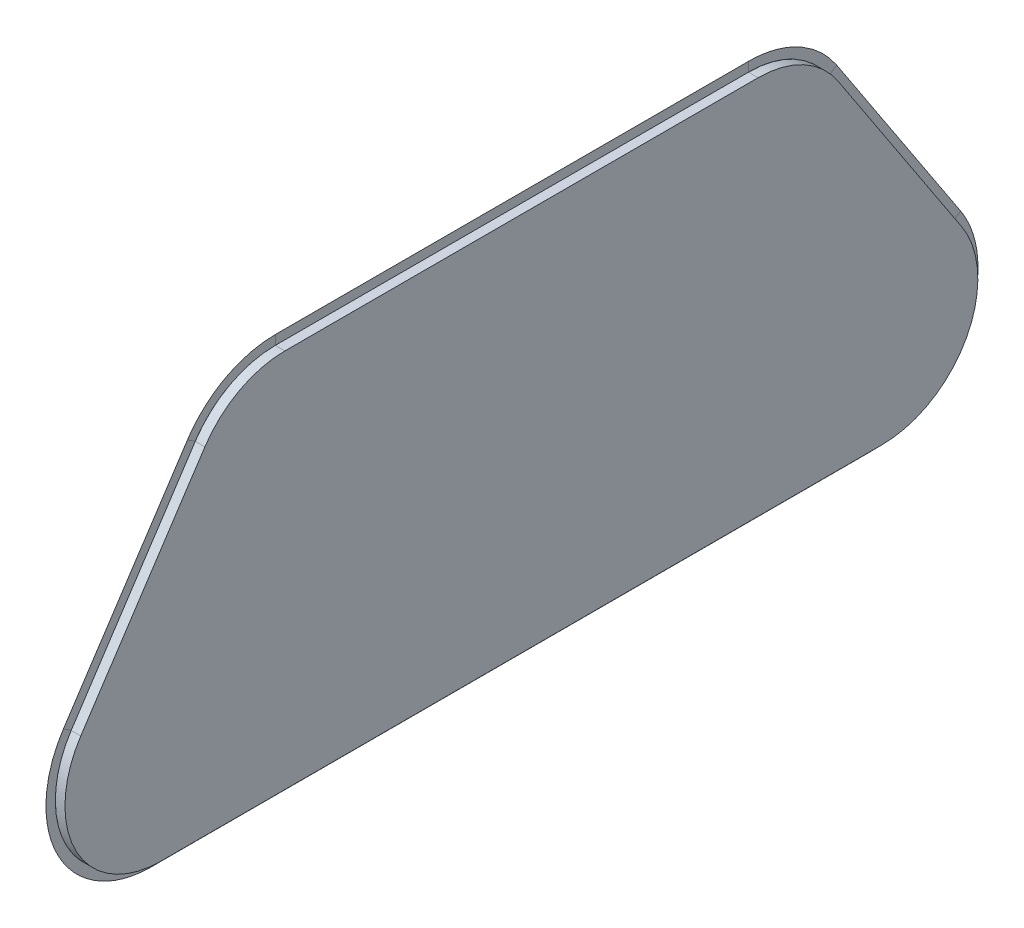
ISO-10303-21;
HEADER;
FILE_DESCRIPTION(('STEP AP214'),'2;1');
FILE_NAME('part.step','',(''),(''),'','','');
FILE_SCHEMA(('AUTOMOTIVE_DESIGN { 1 0 10303 214 1 1 1 1 }'));
ENDSEC;
DATA;
#1=APPLICATION_CONTEXT('core data for automotive mechanical design processes');
#2=APPLICATION_PROTOCOL_DEFINITION('international standard','automotive_design',2000,#1);
#3=PRODUCT_CONTEXT('',#1,'mechanical');
#4=PRODUCT('Part','Part','',(#3));
#5=PRODUCT_RELATED_PRODUCT_CATEGORY('part','',(#4));
#6=PRODUCT_DEFINITION_FORMATION('','',#4);
#7=PRODUCT_DEFINITION_CONTEXT('part definition',#1,'design');
#8=PRODUCT_DEFINITION('design','',#6,#7);
#9=PRODUCT_DEFINITION_SHAPE('','',#8);
#10=(LENGTH_UNIT() NAMED_UNIT(*) SI_UNIT(.MILLI.,.METRE.));
#11=(NAMED_UNIT(*) PLANE_ANGLE_UNIT() SI_UNIT($,.RADIAN.));
#12=(NAMED_UNIT(*) SI_UNIT($,.STERADIAN.) SOLID_ANGLE_UNIT());
#13=UNCERTAINTY_MEASURE_WITH_UNIT(LENGTH_MEASURE(1.E-05),#10,'distance_accuracy_value','');
#14=(GEOMETRIC_REPRESENTATION_CONTEXT(3) GLOBAL_UNCERTAINTY_ASSIGNED_CONTEXT((#13)) GLOBAL_UNIT_ASSIGNED_CONTEXT((#10,
#11,#12)) REPRESENTATION_CONTEXT('',''));
#15=CARTESIAN_POINT('',(0.,0.,0.));
#16=DIRECTION('',(0.,0.,1.));
#17=DIRECTION('',(1.,0.,0.));
#18=AXIS2_PLACEMENT_3D('',#15,#16,#17);
#19=CARTESIAN_POINT('',(220.,47.3671548351233,-10.544114440503));
#20=CARTESIAN_POINT('',(220.034904812875,49.3668502254361,-10.544114440503));
#21=CARTESIAN_POINT('',(220.,47.3671548351233,-10.1469887777139));
#22=CARTESIAN_POINT('',(220.034904812875,49.3593817909838,-10.1075705196872));
#23=CARTESIAN_POINT('',(220.,47.343393296283,-9.34743837210346));
#24=CARTESIAN_POINT('',(220.034904812875,49.3444449220792,-9.23448267805566));
#25=CARTESIAN_POINT('',(220.,47.1980460977618,-7.73366449790399));
#26=CARTESIAN_POINT('',(220.034904812875,49.180264693118,-7.46443837044333));
#27=CARTESIAN_POINT('',(220.,46.6751620014668,-4.88118267092727));
#28=CARTESIAN_POINT('',(220.034904812875,48.6159810452897,-4.35028259738963));
#29=CARTESIAN_POINT('',(220.,45.1633562274969,-0.959543207699796));
#30=CARTESIAN_POINT('',(220.034904812874,46.9444905687507,-0.000270574594249407));
#31=CARTESIAN_POINT('',(220.,42.7209172377154,2.46088140906158));
#32=CARTESIAN_POINT('',(220.034904812875,44.2322549281824,3.78922317017646));
#33=CARTESIAN_POINT('',(220.,40.6269637317133,4.46722611177145));
#34=CARTESIAN_POINT('',(220.034904812874,41.9425972953211,5.97413738779009));
#35=CARTESIAN_POINT('',(220.,39.3595162459252,5.47666595442486));
#36=CARTESIAN_POINT('',(220.034904812875,40.5550345716577,7.08529970104253));
#37=CARTESIAN_POINT('',(220.,38.7050012510926,5.93650895304427));
#38=CARTESIAN_POINT('',(220.034904812875,39.8342625491415,7.57824308604266));
#39=CARTESIAN_POINT('',(220.,38.373417865557,6.15505242808387));
#40=CARTESIAN_POINT('',(220.034904812875,39.4738765378834,7.82471477854272));
#41=(BOUNDED_SURFACE() B_SPLINE_SURFACE(3,1,((#19,#20),(#21,#22),(#23,#24),(#25,#26),(#27,#28),
(#29,#30),(#31,#32),(#33,#34),(#35,#36),(#37,#38),(#39,#40)),.UNSPECIFIED.,.F.,.F.,
.F.) B_SPLINE_SURFACE_WITH_KNOTS((4,1,1,1,1,1,1,1,4),(2,2),(0.,0.0625,0.125,0.25,0.5,0.75,0.875,
0.9375,1.),(0.,1.),
.UNSPECIFIED.) GEOMETRIC_REPRESENTATION_ITEM() RATIONAL_B_SPLINE_SURFACE(((1.,1.),
(0.995017906985336,1.),(0.985676482582842,1.),(0.969484680285186,1.),(0.947688023346032,1.),
(0.935232790809373,1.),(0.947688023346032,1.),(0.969484680285186,1.),(0.985676482582842,1.),
(0.995017906985336,1.),(1.,1.))) REPRESENTATION_ITEM('') SURFACE());
#42=CARTESIAN_POINT('',(220.,47.3671548351233,-10.544114440503));
#43=CARTESIAN_POINT('',(220.,47.3671548351233,-10.1469887777139));
#44=CARTESIAN_POINT('',(220.,47.343393296283,-9.34743837210346));
#45=CARTESIAN_POINT('',(220.,47.1980460977618,-7.73366449790399));
#46=CARTESIAN_POINT('',(220.,46.6751620014668,-4.88118267092727));
#47=CARTESIAN_POINT('',(220.,45.1633562274969,-0.959543207699796));
#48=CARTESIAN_POINT('',(220.,42.7209172377154,2.46088140906158));
#49=CARTESIAN_POINT('',(220.,40.6269637317133,4.46722611177145));
#50=CARTESIAN_POINT('',(220.,39.3595162459252,5.47666595442486));
#51=CARTESIAN_POINT('',(220.,38.7050012510926,5.93650895304427));
#52=CARTESIAN_POINT('',(220.,38.373417865557,6.15505242808387));
#53=(BOUNDED_CURVE() B_SPLINE_CURVE(3,(#42,#43,#44,#45,#46,#47,#48,#49,#50,#51,#52),
.UNSPECIFIED.,.F.,.F.) B_SPLINE_CURVE_WITH_KNOTS((4,1,1,1,1,1,1,1,4),(0.,0.0625,0.125,0.25,0.5,
0.75,0.875,0.9375,1.),
.UNSPECIFIED.) CURVE() GEOMETRIC_REPRESENTATION_ITEM() RATIONAL_B_SPLINE_CURVE((1.,
0.995017906985336,0.985676482582842,0.969484680285186,0.947688023346032,0.935232790809373,
0.947688023346032,0.969484680285186,0.985676482582842,0.995017906985336,1.)) REPRESENTATION_ITEM(''));
#54=CARTESIAN_POINT('',(220.,47.3671548351233,-10.544114440503));
#55=VERTEX_POINT('',#54);
#56=CARTESIAN_POINT('',(220.,38.373417865557,6.15505242808387));
#57=VERTEX_POINT('',#56);
#58=EDGE_CURVE('E542',#55,#57,#53,.T.);
#59=DIRECTION('',(0.0174524064372739,0.550229336163204,0.834831175229428));
#60=VECTOR('',#59,1.);
#61=CARTESIAN_POINT('',(220.017452406437,38.9236472017202,6.9898836033133));
#62=LINE('',#61,#60);
#63=CARTESIAN_POINT('',(220.034904812875,39.4738765378834,7.82471477854273));
#64=VERTEX_POINT('',#63);
#65=EDGE_CURVE('E525',#57,#64,#62,.T.);
#66=CARTESIAN_POINT('',(220.034904812875,49.3668502254361,-10.544114440503));
#67=CARTESIAN_POINT('',(220.034904812875,49.3593817909838,-10.1075705196872));
#68=CARTESIAN_POINT('',(220.034904812875,49.3444449220792,-9.23448267805566));
#69=CARTESIAN_POINT('',(220.034904812875,49.180264693118,-7.46443837044333));
#70=CARTESIAN_POINT('',(220.034904812875,48.6159810452897,-4.35028259738963));
#71=CARTESIAN_POINT('',(220.034904812874,46.9444905687507,-0.000270574594249407));
#72=CARTESIAN_POINT('',(220.034904812875,44.2322549281824,3.78922317017646));
#73=CARTESIAN_POINT('',(220.034904812874,41.9425972953211,5.97413738779009));
#74=CARTESIAN_POINT('',(220.034904812875,40.5550345716577,7.08529970104253));
#75=CARTESIAN_POINT('',(220.034904812875,39.8342625491415,7.57824308604266));
#76=CARTESIAN_POINT('',(220.034904812875,39.4738765378834,7.82471477854272));
#77=B_SPLINE_CURVE_WITH_KNOTS('',3,(#66,#67,#68,#69,#70,#71,#72,#73,#74,#75,#76),.UNSPECIFIED.,
.F.,.F.,(4,1,1,1,1,1,1,1,4),(0.,0.0625,0.125,0.25,0.5,0.75,0.875,0.9375,1.),.UNSPECIFIED.);
#78=CARTESIAN_POINT('',(220.034904812875,49.3668502254361,-10.544114440503));
#79=VERTEX_POINT('',#78);
#80=EDGE_CURVE('E370',#64,#79,#77,.F.);
#81=DIRECTION('',(-0.0174524064372738,-0.999847695156391,0.));
#82=VECTOR('',#81,1.);
#83=CARTESIAN_POINT('',(220.017452406437,48.3670025302797,-10.544114440503));
#84=LINE('',#83,#82);
#85=EDGE_CURVE('E13',#79,#55,#84,.T.);
#86=ORIENTED_EDGE('',*,*,#58,.T.);
#87=ORIENTED_EDGE('',*,*,#65,.T.);
#88=ORIENTED_EDGE('',*,*,#80,.T.);
#89=ORIENTED_EDGE('',*,*,#85,.T.);
#90=EDGE_LOOP('',(#86,#87,#88,#89));
#91=FACE_BOUND('',#90,.T.);
#92=ADVANCED_FACE('F357',(#91),#41,.T.);
#93=CARTESIAN_POINT('',(220.,47.3671548351233,-109.327040639232));
#94=DIRECTION('',(-0.999847695156391,0.0174524064372738,0.));
#95=DIRECTION('',(0.,0.,1.));
#96=AXIS2_PLACEMENT_3D('',#93,#94,#95);
#97=PLANE('',#96);
#98=DIRECTION('',(0.,0.,1.));
#99=VECTOR('',#98,1.);
#100=CARTESIAN_POINT('',(220.,47.3671548351233,-59.9355775398677));
#101=LINE('',#100,#99);
#102=CARTESIAN_POINT('',(220.,47.3671548351233,-109.327040639232));
#103=VERTEX_POINT('',#102);
#104=EDGE_CURVE('E379',#103,#55,#101,.T.);
#105=ORIENTED_EDGE('',*,*,#104,.T.);
#106=ORIENTED_EDGE('',*,*,#85,.F.);
#107=DIRECTION('',(0.,0.,-1.));
#108=VECTOR('',#107,1.);
#109=CARTESIAN_POINT('',(220.034904812875,49.3668502254361,-59.9355775398677));
#110=LINE('',#109,#108);
#111=CARTESIAN_POINT('',(220.034904812875,49.3668502254361,-109.327040639232));
#112=VERTEX_POINT('',#111);
#113=EDGE_CURVE('E543',#79,#112,#110,.T.);
#114=ORIENTED_EDGE('',*,*,#113,.T.);
#115=DIRECTION('',(-0.0174524064372738,-0.999847695156391,0.));
#116=VECTOR('',#115,1.);
#117=CARTESIAN_POINT('',(220.017452406437,48.3670025302797,-109.327040639232));
#118=LINE('',#117,#116);
#119=EDGE_CURVE('E538',#112,#103,#118,.T.);
#120=ORIENTED_EDGE('',*,*,#119,.T.);
#121=EDGE_LOOP('',(#105,#106,#114,#120));
#122=FACE_BOUND('',#121,.T.);
#123=ADVANCED_FACE('F625',(#122),#97,.T.);
#124=CARTESIAN_POINT('',(220.,38.373417865557,6.15505242808387));
#125=DIRECTION('',(-0.999847695156391,0.00960428878813346,0.0145720323677218));
#126=DIRECTION('',(0.,-0.834958343429344,0.550313151521682));
#127=AXIS2_PLACEMENT_3D('',#124,#125,#126);
#128=PLANE('',#127);
#129=DIRECTION('',(0.,-0.834958343429344,0.550313151521682));
#130=VECTOR('',#129,1.);
#131=CARTESIAN_POINT('',(220.,18.7230554542372,19.1064205438894));
#132=LINE('',#131,#130);
#133=CARTESIAN_POINT('',(220.,-0.927306957082622,32.0577886596949));
#134=VERTEX_POINT('',#133);
#135=EDGE_CURVE('E502',#57,#134,#132,.T.);
#136=ORIENTED_EDGE('',*,*,#135,.T.);
#137=DIRECTION('',(0.0174524064372738,0.550229336163203,0.834831175229429));
#138=VECTOR('',#137,1.);
#139=CARTESIAN_POINT('',(220.017452406437,-0.377077620919421,32.8926198349243));
#140=LINE('',#139,#138);
#141=CARTESIAN_POINT('',(220.034904812875,0.173151715243785,33.7274510101537));
#142=VERTEX_POINT('',#141);
#143=EDGE_CURVE('E496',#134,#142,#140,.T.);
#144=ORIENTED_EDGE('',*,*,#143,.T.);
#145=DIRECTION('',(0.,0.834958343429344,-0.550313151521682));
#146=VECTOR('',#145,1.);
#147=CARTESIAN_POINT('',(220.034904812875,19.8235141265636,20.7760828943482));
#148=LINE('',#147,#146);
#149=EDGE_CURVE('E501',#142,#64,#148,.T.);
#150=ORIENTED_EDGE('',*,*,#149,.T.);
#151=ORIENTED_EDGE('',*,*,#65,.F.);
#152=EDGE_LOOP('',(#136,#144,#150,#151));
#153=FACE_BOUND('',#152,.T.);
#154=ADVANCED_FACE('F600',(#153),#128,.T.);
#155=CARTESIAN_POINT('',(220.,38.363087517325,-126.033011561286));
#156=CARTESIAN_POINT('',(220.034904812875,39.4625133121644,-127.703354213462));
#157=CARTESIAN_POINT('',(220.,38.69499849861,-125.814546509256));
#158=CARTESIAN_POINT('',(220.034904812875,39.8232582759278,-127.456959217031));
#159=CARTESIAN_POINT('',(220.,39.3501756336238,-125.354826519129));
#160=CARTESIAN_POINT('',(220.034904812874,40.5447482034547,-126.964169224169));
#161=CARTESIAN_POINT('',(220.,40.6189612817587,-124.345493577547));
#162=CARTESIAN_POINT('',(220.034904812875,41.9337732370248,-125.853122734842));
#163=CARTESIAN_POINT('',(220.,42.715265497387,-122.338946246436));
#164=CARTESIAN_POINT('',(220.034904812875,44.2259780773546,-123.668021113326));
#165=CARTESIAN_POINT('',(220.,45.1606374593197,-118.917247405057));
#166=CARTESIAN_POINT('',(220.034904812874,46.9415053144157,-119.877087101067));
#167=CARTESIAN_POINT('',(220.,46.6743202529073,-114.993393254645));
#168=CARTESIAN_POINT('',(220.034904812875,48.615079248456,-115.524568387975));
#169=CARTESIAN_POINT('',(220.,47.1978453194475,-112.139160422315));
#170=CARTESIAN_POINT('',(220.034904812875,49.1800449500906,-112.40853150078));
#171=CARTESIAN_POINT('',(220.,47.3433655793325,-110.524417761134));
#172=CARTESIAN_POINT('',(220.034904812875,49.3444191791267,-110.637431289567));
#173=CARTESIAN_POINT('',(220.,47.3671548351233,-109.724396749612));
#174=CARTESIAN_POINT('',(220.034904812875,49.3593732099996,-109.763837522677));
#175=CARTESIAN_POINT('',(220.,47.3671548351233,-109.327040639233));
#176=CARTESIAN_POINT('',(220.034904812875,49.3668502254361,-109.327040639233));
#177=(BOUNDED_SURFACE() B_SPLINE_SURFACE(3,1,((#155,#156),(#157,#158),(#159,#160),(#161,#162),
(#163,#164),(#165,#166),(#167,#168),(#169,#170),(#171,#172),(#173,#174),(#175,#176)),
.UNSPECIFIED.,.F.,.F.,.F.) B_SPLINE_SURFACE_WITH_KNOTS((4,1,1,1,1,1,1,1,4),(2,2),(0.,0.0625,
0.125,0.25,0.5,0.75,0.875,0.9375,1.),(0.,1.),
.UNSPECIFIED.) GEOMETRIC_REPRESENTATION_ITEM() RATIONAL_B_SPLINE_SURFACE(((1.,1.),
(0.995011795381524,1.),(0.985658911721881,1.),(0.969447246711834,1.),(0.947623851506001,1.),
(0.935153339959811,1.),(0.947623851506001,1.),(0.969447246711834,1.),(0.985658911721881,1.),
(0.995011795381524,1.),(1.,1.))) REPRESENTATION_ITEM('') SURFACE());
#178=CARTESIAN_POINT('',(220.,38.363087517325,-126.033011561286));
#179=CARTESIAN_POINT('',(220.,38.69499849861,-125.814546509256));
#180=CARTESIAN_POINT('',(220.,39.3501756336238,-125.354826519129));
#181=CARTESIAN_POINT('',(220.,40.6189612817587,-124.345493577547));
#182=CARTESIAN_POINT('',(220.,42.715265497387,-122.338946246436));
#183=CARTESIAN_POINT('',(220.,45.1606374593197,-118.917247405057));
#184=CARTESIAN_POINT('',(220.,46.6743202529073,-114.993393254645));
#185=CARTESIAN_POINT('',(220.,47.1978453194475,-112.139160422315));
#186=CARTESIAN_POINT('',(220.,47.3433655793325,-110.524417761134));
#187=CARTESIAN_POINT('',(220.,47.3671548351233,-109.724396749612));
#188=CARTESIAN_POINT('',(220.,47.3671548351233,-109.327040639233));
#189=(BOUNDED_CURVE() B_SPLINE_CURVE(3,(#178,#179,#180,#181,#182,#183,#184,#185,#186,#187,#188),
.UNSPECIFIED.,.F.,.F.) B_SPLINE_CURVE_WITH_KNOTS((4,1,1,1,1,1,1,1,4),(0.,0.0625,0.125,0.25,0.5,
0.75,0.875,0.9375,1.),
.UNSPECIFIED.) CURVE() GEOMETRIC_REPRESENTATION_ITEM() RATIONAL_B_SPLINE_CURVE((1.,
0.995011795381524,0.985658911721881,0.969447246711834,0.947623851506001,0.935153339959811,
0.947623851506001,0.969447246711834,0.985658911721881,0.995011795381524,1.)) REPRESENTATION_ITEM(''));
#190=CARTESIAN_POINT('',(220.,38.363087517325,-126.033011561286));
#191=VERTEX_POINT('',#190);
#192=EDGE_CURVE('E533',#191,#103,#189,.T.);
#193=CARTESIAN_POINT('',(220.034904812875,39.4625133121644,-127.703354213462));
#194=CARTESIAN_POINT('',(220.034904812875,39.8232582759278,-127.456959217031));
#195=CARTESIAN_POINT('',(220.034904812874,40.5447482034547,-126.964169224169));
#196=CARTESIAN_POINT('',(220.034904812875,41.9337732370248,-125.853122734842));
#197=CARTESIAN_POINT('',(220.034904812875,44.2259780773546,-123.668021113326));
#198=CARTESIAN_POINT('',(220.034904812874,46.9415053144157,-119.877087101067));
#199=CARTESIAN_POINT('',(220.034904812875,48.615079248456,-115.524568387975));
#200=CARTESIAN_POINT('',(220.034904812875,49.1800449500906,-112.40853150078));
#201=CARTESIAN_POINT('',(220.034904812875,49.3444191791267,-110.637431289567));
#202=CARTESIAN_POINT('',(220.034904812875,49.3593732099996,-109.763837522677));
#203=CARTESIAN_POINT('',(220.034904812875,49.3668502254361,-109.327040639233));
#204=B_SPLINE_CURVE_WITH_KNOTS('',3,(#193,#194,#195,#196,#197,#198,#199,#200,#201,#202,#203),
.UNSPECIFIED.,.F.,.F.,(4,1,1,1,1,1,1,1,4),(0.,0.0625,0.125,0.25,0.5,0.75,0.875,0.9375,1.),.UNSPECIFIED.);
#205=CARTESIAN_POINT('',(220.034904812875,39.4625133121644,-127.703354213462));
#206=VERTEX_POINT('',#205);
#207=EDGE_CURVE('E519',#112,#206,#204,.F.);
#208=DIRECTION('',(-0.0174524064372738,-0.549712897419708,0.835171326088233));
#209=VECTOR('',#208,1.);
#210=CARTESIAN_POINT('',(220.017452406437,38.9128004147447,-126.868182887374));
#211=LINE('',#210,#209);
#212=EDGE_CURVE('E514',#206,#191,#211,.T.);
#213=ORIENTED_EDGE('',*,*,#192,.T.);
#214=ORIENTED_EDGE('',*,*,#119,.F.);
#215=ORIENTED_EDGE('',*,*,#207,.T.);
#216=ORIENTED_EDGE('',*,*,#212,.T.);
#217=EDGE_LOOP('',(#213,#214,#215,#216));
#218=FACE_BOUND('',#217,.T.);
#219=ADVANCED_FACE('F628',(#218),#177,.T.);
#220=CARTESIAN_POINT('',(220.,-0.927306957082619,32.0577886596949));
#221=CARTESIAN_POINT('',(220.034904812875,0.173151715243788,33.7274510101537));
#222=CARTESIAN_POINT('',(220.,-1.23700045082468,32.2619047139725));
#223=CARTESIAN_POINT('',(220.034904812875,-0.170527520574546,33.9462644650517));
#224=CARTESIAN_POINT('',(220.,-1.8778397220846,32.6592954713684));
#225=CARTESIAN_POINT('',(220.034904812875,-0.857885992211212,34.3838913748477));
#226=CARTESIAN_POINT('',(220.,-3.24535558673676,33.4032483997321));
#227=CARTESIAN_POINT('',(220.034904812875,-2.3506542167144,35.1921869706593));
#228=CARTESIAN_POINT('',(220.,-5.91388253844428,34.5625296931835));
#229=CARTESIAN_POINT('',(220.034904812875,-5.19452333340101,36.4389795747554));
#230=CARTESIAN_POINT('',(220.,-10.2620671226154,35.5419502335157));
#231=CARTESIAN_POINT('',(220.034904812875,-9.9258255720584,37.5469244069014));
#232=CARTESIAN_POINT('',(220.,-15.958109396507,35.2419578031619));
#233=CARTESIAN_POINT('',(220.034904812875,-16.2663222258484,37.2530404115033));
#234=CARTESIAN_POINT('',(220.,-21.5591015638545,33.2308765097019));
#235=CARTESIAN_POINT('',(220.034904812875,-22.5238530027403,35.0221836514583));
#236=CARTESIAN_POINT('',(220.,-26.3205703204049,29.6610058526629));
#237=CARTESIAN_POINT('',(220.034904812875,-27.8301269501109,31.0250759342404));
#238=CARTESIAN_POINT('',(220.,-29.7056584780405,25.0701376113316));
#239=CARTESIAN_POINT('',(220.034904812875,-31.5647665398288,25.8927535793618));
#240=CARTESIAN_POINT('',(220.,-31.2807462880772,20.9005966097917));
#241=CARTESIAN_POINT('',(220.034904812875,-33.2433766039262,21.3325966876185));
#242=CARTESIAN_POINT('',(220.,-31.7813201764431,18.0345200246981));
#243=CARTESIAN_POINT('',(220.034904812875,-33.7673752927291,18.2719580737659));
#244=CARTESIAN_POINT('',(220.,-31.9127124370198,16.4832941631432));
#245=CARTESIAN_POINT('',(220.034904812875,-33.9139721271669,16.5807430932186));
#246=CARTESIAN_POINT('',(220.,-31.9335699875163,15.7295307067194));
#247=CARTESIAN_POINT('',(220.034904812875,-33.926834294275,15.7659955584782));
#248=CARTESIAN_POINT('',(220.,-31.9335699875163,15.358621791108));
#249=CARTESIAN_POINT('',(220.034904812875,-33.933265377829,15.358621791108));
#250=(BOUNDED_SURFACE() B_SPLINE_SURFACE(3,1,((#220,#221),(#222,#223),(#224,#225),(#226,#227),
(#228,#229),(#230,#231),(#232,#233),(#234,#235),(#236,#237),(#238,#239),(#240,#241),(#242,#243),
(#244,#245),(#246,#247),(#248,#249)),.UNSPECIFIED.,.F.,.F.,.F.) B_SPLINE_SURFACE_WITH_KNOTS((4,
1,1,1,1,1,1,1,1,1,1,1,4),(2,2),(0.,0.03125,0.0625,0.125,0.25,0.375,0.5,0.625,0.75,0.875,0.9375,
0.96875,1.),(0.,1.),
.UNSPECIFIED.) GEOMETRIC_REPRESENTATION_ITEM() RATIONAL_B_SPLINE_SURFACE(((1.,1.),
(0.989045345311631,1.),(0.967820701852915,1.),(0.928110078607576,1.),(0.865805480067476,1.),
(0.797338888265168,1.),(0.748042942167506,1.),(0.731610960134952,1.),(0.748042942167506,1.),
(0.797338888265168,1.),(0.865805480067476,1.),(0.928110078607577,1.),(0.967820701852915,1.),
(0.989045345311631,1.),(1.,1.))) REPRESENTATION_ITEM('') SURFACE());
#251=CARTESIAN_POINT('',(220.,-0.927306957082619,32.0577886596949));
#252=CARTESIAN_POINT('',(220.,-1.23700045082468,32.2619047139725));
#253=CARTESIAN_POINT('',(220.,-1.8778397220846,32.6592954713684));
#254=CARTESIAN_POINT('',(220.,-3.24535558673676,33.4032483997321));
#255=CARTESIAN_POINT('',(220.,-5.91388253844428,34.5625296931835));
#256=CARTESIAN_POINT('',(220.,-10.2620671226154,35.5419502335157));
#257=CARTESIAN_POINT('',(220.,-15.958109396507,35.2419578031619));
#258=CARTESIAN_POINT('',(220.,-21.5591015638545,33.2308765097019));
#259=CARTESIAN_POINT('',(220.,-26.3205703204049,29.6610058526629));
#260=CARTESIAN_POINT('',(220.,-29.7056584780405,25.0701376113316));
#261=CARTESIAN_POINT('',(220.,-31.2807462880772,20.9005966097917));
#262=CARTESIAN_POINT('',(220.,-31.7813201764431,18.0345200246981));
#263=CARTESIAN_POINT('',(220.,-31.9127124370198,16.4832941631432));
#264=CARTESIAN_POINT('',(220.,-31.9335699875163,15.7295307067194));
#265=CARTESIAN_POINT('',(220.,-31.9335699875163,15.358621791108));
#266=(BOUNDED_CURVE() B_SPLINE_CURVE(3,(#251,#252,#253,#254,#255,#256,#257,#258,#259,#260,#261,
#262,#263,#264,#265),.UNSPECIFIED.,.F.,.F.) B_SPLINE_CURVE_WITH_KNOTS((4,1,1,1,1,1,1,1,1,1,1,1,
4),(0.,0.03125,0.0625,0.125,0.25,0.375,0.5,0.625,0.75,0.875,0.9375,0.96875,1.),
.UNSPECIFIED.) CURVE() GEOMETRIC_REPRESENTATION_ITEM() RATIONAL_B_SPLINE_CURVE((1.,
0.989045345311631,0.967820701852915,0.928110078607576,0.865805480067476,0.797338888265168,
0.748042942167506,0.731610960134952,0.748042942167506,0.797338888265168,0.865805480067476,
0.928110078607577,0.967820701852915,0.989045345311631,1.)) REPRESENTATION_ITEM(''));
#267=CARTESIAN_POINT('',(220.,-31.9335699875163,15.358621791108));
#268=VERTEX_POINT('',#267);
#269=EDGE_CURVE('E463',#134,#268,#266,.T.);
#270=DIRECTION('',(0.0174524064372738,-0.999847695156391,0.));
#271=VECTOR('',#270,1.);
#272=CARTESIAN_POINT('',(220.017452406437,-32.9334176826726,15.358621791108));
#273=LINE('',#272,#271);
#274=CARTESIAN_POINT('',(220.034904812875,-33.933265377829,15.358621791108));
#275=VERTEX_POINT('',#274);
#276=EDGE_CURVE('E470',#268,#275,#273,.T.);
#277=CARTESIAN_POINT('',(220.034904812875,0.173151715243788,33.7274510101537));
#278=CARTESIAN_POINT('',(220.034904812875,-0.170527520574546,33.9462644650517));
#279=CARTESIAN_POINT('',(220.034904812875,-0.857885992211212,34.3838913748477));
#280=CARTESIAN_POINT('',(220.034904812875,-2.3506542167144,35.1921869706593));
#281=CARTESIAN_POINT('',(220.034904812875,-5.19452333340101,36.4389795747554));
#282=CARTESIAN_POINT('',(220.034904812875,-9.9258255720584,37.5469244069014));
#283=CARTESIAN_POINT('',(220.034904812875,-16.2663222258484,37.2530404115033));
#284=CARTESIAN_POINT('',(220.034904812875,-22.5238530027403,35.0221836514583));
#285=CARTESIAN_POINT('',(220.034904812875,-27.8301269501109,31.0250759342404));
#286=CARTESIAN_POINT('',(220.034904812875,-31.5647665398288,25.8927535793618));
#287=CARTESIAN_POINT('',(220.034904812875,-33.2433766039262,21.3325966876185));
#288=CARTESIAN_POINT('',(220.034904812875,-33.7673752927291,18.2719580737659));
#289=CARTESIAN_POINT('',(220.034904812875,-33.9139721271669,16.5807430932186));
#290=CARTESIAN_POINT('',(220.034904812875,-33.926834294275,15.7659955584782));
#291=CARTESIAN_POINT('',(220.034904812875,-33.933265377829,15.358621791108));
#292=B_SPLINE_CURVE_WITH_KNOTS('',3,(#277,#278,#279,#280,#281,#282,#283,#284,#285,#286,#287,
#288,#289,#290,#291),.UNSPECIFIED.,.F.,.F.,(4,1,1,1,1,1,1,1,1,1,1,1,4),(0.,0.03125,0.0625,0.125,
0.25,0.375,0.5,0.625,0.75,0.875,0.9375,0.96875,1.),.UNSPECIFIED.);
#293=EDGE_CURVE('E483',#275,#142,#292,.F.);
#294=ORIENTED_EDGE('',*,*,#269,.T.);
#295=ORIENTED_EDGE('',*,*,#276,.T.);
#296=ORIENTED_EDGE('',*,*,#293,.T.);
#297=ORIENTED_EDGE('',*,*,#143,.F.);
#298=EDGE_LOOP('',(#294,#295,#296,#297));
#299=FACE_BOUND('',#298,.T.);
#300=ADVANCED_FACE('F597',(#299),#250,.T.);
#301=CARTESIAN_POINT('',(220.,-0.937637305314603,-151.900895955901));
#302=DIRECTION('',(-0.999847695156391,0.00959527431633429,-0.0145779697230476));
#303=DIRECTION('',(0.,0.835298546102664,0.549796634110083));
#304=AXIS2_PLACEMENT_3D('',#301,#302,#303);
#305=PLANE('',#304);
#306=DIRECTION('',(0.,0.835298546102664,0.549796634110083));
#307=VECTOR('',#306,1.);
#308=CARTESIAN_POINT('',(220.,18.7127251060052,-138.966953758593));
#309=LINE('',#308,#307);
#310=CARTESIAN_POINT('',(220.,-0.937637305314609,-151.900895955901));
#311=VERTEX_POINT('',#310);
#312=EDGE_CURVE('E439',#311,#191,#309,.T.);
#313=ORIENTED_EDGE('',*,*,#312,.T.);
#314=ORIENTED_EDGE('',*,*,#212,.F.);
#315=DIRECTION('',(0.,-0.835298546102664,-0.549796634110083));
#316=VECTOR('',#315,1.);
#317=CARTESIAN_POINT('',(220.034904812875,19.8121509008446,-140.63729641077));
#318=LINE('',#317,#316);
#319=CARTESIAN_POINT('',(220.034904812875,0.161788489524807,-153.571238608077));
#320=VERTEX_POINT('',#319);
#321=EDGE_CURVE('E446',#206,#320,#318,.T.);
#322=ORIENTED_EDGE('',*,*,#321,.T.);
#323=DIRECTION('',(-0.0174524064372738,-0.549712897419707,0.835171326088234));
#324=VECTOR('',#323,1.);
#325=CARTESIAN_POINT('',(220.017452406437,-0.387924407894895,-152.736067281989));
#326=LINE('',#325,#324);
#327=EDGE_CURVE('E424',#320,#311,#326,.T.);
#328=ORIENTED_EDGE('',*,*,#327,.T.);
#329=EDGE_LOOP('',(#313,#314,#322,#328));
#330=FACE_BOUND('',#329,.T.);
#331=ADVANCED_FACE('F461',(#330),#305,.T.);
#332=CARTESIAN_POINT('',(220.,-31.9335699875163,15.358621791108));
#333=DIRECTION('',(-0.999847695156391,-0.0174524064372738,0.));
#334=DIRECTION('',(0.,0.,-1.));
#335=AXIS2_PLACEMENT_3D('',#332,#333,#334);
#336=PLANE('',#335);
#337=DIRECTION('',(0.,0.,-1.));
#338=VECTOR('',#337,1.);
#339=CARTESIAN_POINT('',(220.,-31.9335699875162,-59.9181516213698));
#340=LINE('',#339,#338);
#341=CARTESIAN_POINT('',(220.,-31.9335699875162,-135.194925033848));
#342=VERTEX_POINT('',#341);
#343=EDGE_CURVE('E427',#268,#342,#340,.T.);
#344=ORIENTED_EDGE('',*,*,#343,.T.);
#345=DIRECTION('',(0.0174524064372738,-0.999847695156391,0.));
#346=VECTOR('',#345,1.);
#347=CARTESIAN_POINT('',(220.017452406437,-32.9334176826726,-135.194925033848));
#348=LINE('',#347,#346);
#349=CARTESIAN_POINT('',(220.034904812875,-33.933265377829,-135.194925033848));
#350=VERTEX_POINT('',#349);
#351=EDGE_CURVE('E420',#342,#350,#348,.T.);
#352=ORIENTED_EDGE('',*,*,#351,.T.);
#353=DIRECTION('',(0.,0.,1.));
#354=VECTOR('',#353,1.);
#355=CARTESIAN_POINT('',(220.034904812875,-33.933265377829,-59.9181516213698));
#356=LINE('',#355,#354);
#357=EDGE_CURVE('E433',#350,#275,#356,.T.);
#358=ORIENTED_EDGE('',*,*,#357,.T.);
#359=ORIENTED_EDGE('',*,*,#276,.F.);
#360=EDGE_LOOP('',(#344,#352,#358,#359));
#361=FACE_BOUND('',#360,.T.);
#362=ADVANCED_FACE('F432',(#361),#336,.T.);
#363=CARTESIAN_POINT('',(220.,-31.9335699875162,-135.194925033848));
#364=CARTESIAN_POINT('',(220.034904812875,-33.933265377829,-135.194925033848));
#365=CARTESIAN_POINT('',(220.,-31.9335699875162,-135.565770029854));
#366=CARTESIAN_POINT('',(220.034904812875,-33.9268364314302,-135.602228940231));
#367=CARTESIAN_POINT('',(220.,-31.9127197450569,-136.319397127786));
#368=CARTESIAN_POINT('',(220.034904812874,-33.9139785386324,-136.416836752997));
#369=CARTESIAN_POINT('',(220.,-31.7813770050345,-137.870317242572));
#370=CARTESIAN_POINT('',(220.034904812875,-33.7674353396959,-138.107727447642));
#371=CARTESIAN_POINT('',(220.,-31.2810161553753,-140.735733758693));
#372=CARTESIAN_POINT('',(220.034904812874,-33.2436457932899,-141.167717669541));
#373=CARTESIAN_POINT('',(220.,-29.7066938021391,-144.904234003329));
#374=CARTESIAN_POINT('',(220.034904812875,-31.5658099993683,-145.726761999622));
#375=CARTESIAN_POINT('',(220.,-26.3234187533581,-149.494168052931));
#376=CARTESIAN_POINT('',(220.034904812875,-27.8331716112333,-150.857977791471));
#377=CARTESIAN_POINT('',(220.,-21.5645274661675,-153.064015735984));
#378=CARTESIAN_POINT('',(220.034904812875,-22.529819429199,-154.854999620991));
#379=CARTESIAN_POINT('',(220.,-15.9662164749122,-155.076420468807));
#380=CARTESIAN_POINT('',(220.034904812875,-16.2753477270775,-157.08733283978));
#381=CARTESIAN_POINT('',(220.,-10.2721380024839,-155.37893490686));
#382=CARTESIAN_POINT('',(220.034904812875,-9.93705861426012,-157.384075087265));
#383=CARTESIAN_POINT('',(220.,-5.9246386778977,-154.402136675828));
#384=CARTESIAN_POINT('',(220.034904812874,-5.20642704163821,-156.279021659089));
#385=CARTESIAN_POINT('',(220.,-3.25606371701974,-153.244691010188));
#386=CARTESIAN_POINT('',(220.034904812875,-2.36244392860212,-155.034169981257));
#387=CARTESIAN_POINT('',(220.,-1.8883706036391,-152.501710751087));
#388=CARTESIAN_POINT('',(220.034904812874,-0.869476432219683,-154.226931289706));
#389=CARTESIAN_POINT('',(220.,-1.24740359130848,-152.104785286482));
#390=CARTESIAN_POINT('',(220.034904812874,-0.181966484390027,-153.789802835287));
#391=CARTESIAN_POINT('',(220.,-0.937637305314614,-151.900895955901));
#392=CARTESIAN_POINT('',(220.034904812875,0.161788489524801,-153.571238608077));
#393=(BOUNDED_SURFACE() B_SPLINE_SURFACE(3,1,((#363,#364),(#365,#366),(#367,#368),(#369,#370),
(#371,#372),(#373,#374),(#375,#376),(#377,#378),(#379,#380),(#381,#382),(#383,#384),(#385,#386),
(#387,#388),(#389,#390),(#391,#392)),.UNSPECIFIED.,.F.,.F.,.F.) B_SPLINE_SURFACE_WITH_KNOTS((4,
1,1,1,1,1,1,1,1,1,1,1,4),(2,2),(0.,0.03125,0.0625,0.125,0.25,0.375,0.5,0.625,0.75,0.875,0.9375,
0.96875,1.),(0.,1.),
.UNSPECIFIED.) GEOMETRIC_REPRESENTATION_ITEM() RATIONAL_B_SPLINE_SURFACE(((1.,1.),
(0.989051017086529,1.),(0.96783736269168,1.),(0.928147299630349,1.),(0.865874959309984,1.),
(0.797443816100792,1.),(0.748173392990174,1.),(0.731749918619968,1.),(0.748173392990174,1.),
(0.797443816100792,1.),(0.865874959309984,1.),(0.928147299630348,1.),(0.96783736269168,1.),
(0.989051017086529,1.),(1.,1.))) REPRESENTATION_ITEM('') SURFACE());
#394=CARTESIAN_POINT('',(220.,-31.9335699875162,-135.194925033848));
#395=CARTESIAN_POINT('',(220.,-31.9335699875162,-135.565770029854));
#396=CARTESIAN_POINT('',(220.,-31.9127197450569,-136.319397127786));
#397=CARTESIAN_POINT('',(220.,-31.7813770050345,-137.870317242572));
#398=CARTESIAN_POINT('',(220.,-31.2810161553753,-140.735733758693));
#399=CARTESIAN_POINT('',(220.,-29.7066938021391,-144.904234003329));
#400=CARTESIAN_POINT('',(220.,-26.3234187533581,-149.494168052931));
#401=CARTESIAN_POINT('',(220.,-21.5645274661675,-153.064015735984));
#402=CARTESIAN_POINT('',(220.,-15.9662164749122,-155.076420468807));
#403=CARTESIAN_POINT('',(220.,-10.2721380024839,-155.37893490686));
#404=CARTESIAN_POINT('',(220.,-5.9246386778977,-154.402136675828));
#405=CARTESIAN_POINT('',(220.,-3.25606371701974,-153.244691010188));
#406=CARTESIAN_POINT('',(220.,-1.8883706036391,-152.501710751087));
#407=CARTESIAN_POINT('',(220.,-1.24740359130848,-152.104785286482));
#408=CARTESIAN_POINT('',(220.,-0.937637305314614,-151.900895955901));
#409=(BOUNDED_CURVE() B_SPLINE_CURVE(3,(#394,#395,#396,#397,#398,#399,#400,#401,#402,#403,#404,
#405,#406,#407,#408),.UNSPECIFIED.,.F.,.F.) B_SPLINE_CURVE_WITH_KNOTS((4,1,1,1,1,1,1,1,1,1,1,1,
4),(0.,0.03125,0.0625,0.125,0.25,0.375,0.5,0.625,0.75,0.875,0.9375,0.96875,1.),
.UNSPECIFIED.) CURVE() GEOMETRIC_REPRESENTATION_ITEM() RATIONAL_B_SPLINE_CURVE((1.,
0.989051017086529,0.96783736269168,0.928147299630349,0.865874959309984,0.797443816100792,
0.748173392990174,0.731749918619968,0.748173392990174,0.797443816100792,0.865874959309984,
0.928147299630348,0.96783736269168,0.989051017086529,1.)) REPRESENTATION_ITEM(''));
#410=EDGE_CURVE('E428',#342,#311,#409,.T.);
#411=CARTESIAN_POINT('',(220.034904812875,-33.933265377829,-135.194925033848));
#412=CARTESIAN_POINT('',(220.034904812875,-33.9268364314302,-135.602228940231));
#413=CARTESIAN_POINT('',(220.034904812874,-33.9139785386324,-136.416836752997));
#414=CARTESIAN_POINT('',(220.034904812875,-33.7674353396959,-138.107727447642));
#415=CARTESIAN_POINT('',(220.034904812874,-33.2436457932899,-141.167717669541));
#416=CARTESIAN_POINT('',(220.034904812875,-31.5658099993683,-145.726761999622));
#417=CARTESIAN_POINT('',(220.034904812875,-27.8331716112333,-150.857977791471));
#418=CARTESIAN_POINT('',(220.034904812875,-22.529819429199,-154.854999620991));
#419=CARTESIAN_POINT('',(220.034904812875,-16.2753477270775,-157.08733283978));
#420=CARTESIAN_POINT('',(220.034904812875,-9.93705861426012,-157.384075087265));
#421=CARTESIAN_POINT('',(220.034904812874,-5.20642704163821,-156.279021659089));
#422=CARTESIAN_POINT('',(220.034904812875,-2.36244392860212,-155.034169981257));
#423=CARTESIAN_POINT('',(220.034904812874,-0.869476432219683,-154.226931289706));
#424=CARTESIAN_POINT('',(220.034904812874,-0.181966484390027,-153.789802835287));
#425=CARTESIAN_POINT('',(220.034904812875,0.161788489524801,-153.571238608077));
#426=B_SPLINE_CURVE_WITH_KNOTS('',3,(#411,#412,#413,#414,#415,#416,#417,#418,#419,#420,#421,
#422,#423,#424,#425),.UNSPECIFIED.,.F.,.F.,(4,1,1,1,1,1,1,1,1,1,1,1,4),(0.,0.03125,0.0625,0.125,
0.25,0.375,0.5,0.625,0.75,0.875,0.9375,0.96875,1.),.UNSPECIFIED.);
#427=EDGE_CURVE('E362',#320,#350,#426,.F.);
#428=ORIENTED_EDGE('',*,*,#410,.T.);
#429=ORIENTED_EDGE('',*,*,#327,.F.);
#430=ORIENTED_EDGE('',*,*,#427,.T.);
#431=ORIENTED_EDGE('',*,*,#351,.F.);
#432=EDGE_LOOP('',(#428,#429,#430,#431));
#433=FACE_BOUND('',#432,.T.);
#434=ADVANCED_FACE('F358',(#433),#393,.T.);
#435=OPEN_SHELL('',(#92,#123,#154,#219,#300,#331,#362,#434));
#436=SHELL_BASED_SURFACE_MODEL('B2',(#435));
#437=CARTESIAN_POINT('',(220.,27.3671548351233,-109.327040639233));
#438=DIRECTION('',(1.,0.,0.));
#439=DIRECTION('',(0.,0.,-1.));
#440=AXIS2_PLACEMENT_3D('',#437,#438,#439);
#441=CYLINDRICAL_SURFACE('',#440,20.);
#442=DIRECTION('',(1.,0.,0.));
#443=VECTOR('',#442,1.);
#444=CARTESIAN_POINT('',(220.,38.363087517325,-126.033011561286));
#445=LINE('',#444,#443);
#446=CARTESIAN_POINT('',(220.,38.363087517325,-126.033011561286));
#447=VERTEX_POINT('',#446);
#448=CARTESIAN_POINT('',(222.,38.363087517325,-126.033011561286));
#449=VERTEX_POINT('',#448);
#450=EDGE_CURVE('E355',#447,#449,#445,.T.);
#451=ORIENTED_EDGE('',*,*,#450,.F.);
#452=CARTESIAN_POINT('',(220.,27.3671548351233,-109.327040639233));
#453=DIRECTION('',(1.,0.,0.));
#454=DIRECTION('',(0.,0.,-1.));
#455=AXIS2_PLACEMENT_3D('',#452,#453,#454);
#456=CIRCLE('',#455,20.);
#457=CARTESIAN_POINT('',(220.,47.3671548351233,-109.327040639233));
#458=VERTEX_POINT('',#457);
#459=EDGE_CURVE('E828',#447,#458,#456,.T.);
#460=ORIENTED_EDGE('',*,*,#459,.T.);
#461=DIRECTION('',(1.,0.,0.));
#462=VECTOR('',#461,1.);
#463=CARTESIAN_POINT('',(220.,47.3671548351233,-109.327040639233));
#464=LINE('',#463,#462);
#465=CARTESIAN_POINT('',(222.,47.3671548351233,-109.327040639233));
#466=VERTEX_POINT('',#465);
#467=EDGE_CURVE('E737',#458,#466,#464,.T.);
#468=ORIENTED_EDGE('',*,*,#467,.T.);
#469=CARTESIAN_POINT('',(222.,27.3671548351233,-109.327040639233));
#470=DIRECTION('',(1.,0.,0.));
#471=DIRECTION('',(0.,0.,-1.));
#472=AXIS2_PLACEMENT_3D('',#469,#470,#471);
#473=CIRCLE('',#472,20.);
#474=EDGE_CURVE('E827',#449,#466,#473,.T.);
#475=ORIENTED_EDGE('',*,*,#474,.F.);
#476=EDGE_LOOP('',(#451,#460,#468,#475));
#477=FACE_BOUND('',#476,.T.);
#478=ADVANCED_FACE('F727',(#477),#441,.T.);
#479=CARTESIAN_POINT('',(220.,47.3671548351233,-10.544114440503));
#480=DIRECTION('',(0.,1.,0.));
#481=DIRECTION('',(0.,0.,1.));
#482=AXIS2_PLACEMENT_3D('',#479,#480,#481);
#483=PLANE('',#482);
#484=ORIENTED_EDGE('',*,*,#467,.F.);
#485=DIRECTION('',(0.,0.,1.));
#486=VECTOR('',#485,1.);
#487=CARTESIAN_POINT('',(220.,47.3671548351233,-10.544114440503));
#488=LINE('',#487,#486);
#489=CARTESIAN_POINT('',(220.,47.3671548351233,-10.544114440503));
#490=VERTEX_POINT('',#489);
#491=EDGE_CURVE('E852',#458,#490,#488,.T.);
#492=ORIENTED_EDGE('',*,*,#491,.T.);
#493=DIRECTION('',(1.,0.,0.));
#494=VECTOR('',#493,1.);
#495=CARTESIAN_POINT('',(220.,47.3671548351233,-10.544114440503));
#496=LINE('',#495,#494);
#497=CARTESIAN_POINT('',(222.,47.3671548351233,-10.544114440503));
#498=VERTEX_POINT('',#497);
#499=EDGE_CURVE('E821',#490,#498,#496,.T.);
#500=ORIENTED_EDGE('',*,*,#499,.T.);
#501=DIRECTION('',(0.,0.,-1.));
#502=VECTOR('',#501,1.);
#503=CARTESIAN_POINT('',(222.,47.3671548351233,-135.194925033848));
#504=LINE('',#503,#502);
#505=EDGE_CURVE('E838',#466,#498,#504,.F.);
#506=ORIENTED_EDGE('',*,*,#505,.F.);
#507=EDGE_LOOP('',(#484,#492,#500,#506));
#508=FACE_BOUND('',#507,.T.);
#509=ADVANCED_FACE('F842',(#508),#483,.T.);
#510=CARTESIAN_POINT('',(220.,27.3671548351233,-10.544114440503));
#511=DIRECTION('',(1.,0.,0.));
#512=DIRECTION('',(0.,0.,-1.));
#513=AXIS2_PLACEMENT_3D('',#510,#511,#512);
#514=CYLINDRICAL_SURFACE('',#513,20.);
#515=ORIENTED_EDGE('',*,*,#499,.F.);
#516=CARTESIAN_POINT('',(220.,27.3671548351233,-10.544114440503));
#517=DIRECTION('',(1.,0.,0.));
#518=DIRECTION('',(0.,0.,-1.));
#519=AXIS2_PLACEMENT_3D('',#516,#517,#518);
#520=CIRCLE('',#519,20.);
#521=CARTESIAN_POINT('',(220.,38.373417865557,6.15505242808387));
#522=VERTEX_POINT('',#521);
#523=EDGE_CURVE('E854',#490,#522,#520,.T.);
#524=ORIENTED_EDGE('',*,*,#523,.T.);
#525=DIRECTION('',(1.,0.,0.));
#526=VECTOR('',#525,1.);
#527=CARTESIAN_POINT('',(220.,38.373417865557,6.15505242808387));
#528=LINE('',#527,#526);
#529=CARTESIAN_POINT('',(222.,38.373417865557,6.15505242808387));
#530=VERTEX_POINT('',#529);
#531=EDGE_CURVE('E819',#522,#530,#528,.T.);
#532=ORIENTED_EDGE('',*,*,#531,.T.);
#533=CARTESIAN_POINT('',(222.,27.3671548351233,-10.544114440503));
#534=DIRECTION('',(1.,0.,0.));
#535=DIRECTION('',(0.,0.,-1.));
#536=AXIS2_PLACEMENT_3D('',#533,#534,#535);
#537=CIRCLE('',#536,20.);
#538=EDGE_CURVE('E843',#498,#530,#537,.T.);
#539=ORIENTED_EDGE('',*,*,#538,.F.);
#540=EDGE_LOOP('',(#515,#524,#532,#539));
#541=FACE_BOUND('',#540,.T.);
#542=ADVANCED_FACE('F864',(#541),#514,.T.);
#543=CARTESIAN_POINT('',(220.,38.373417865557,6.15505242808387));
#544=DIRECTION('',(0.,0.550313151521682,0.834958343429344));
#545=DIRECTION('',(0.,-0.834958343429344,0.550313151521682));
#546=AXIS2_PLACEMENT_3D('',#543,#544,#545);
#547=PLANE('',#546);
#548=ORIENTED_EDGE('',*,*,#531,.F.);
#549=DIRECTION('',(0.,-0.834958343429344,0.550313151521682));
#550=VECTOR('',#549,1.);
#551=CARTESIAN_POINT('',(220.,38.373417865557,6.15505242808387));
#552=LINE('',#551,#550);
#553=CARTESIAN_POINT('',(220.,-0.927306957082622,32.0577886596949));
#554=VERTEX_POINT('',#553);
#555=EDGE_CURVE('E812',#522,#554,#552,.T.);
#556=ORIENTED_EDGE('',*,*,#555,.T.);
#557=DIRECTION('',(1.,0.,0.));
#558=VECTOR('',#557,1.);
#559=CARTESIAN_POINT('',(220.,-0.927306957082622,32.0577886596949));
#560=LINE('',#559,#558);
#561=CARTESIAN_POINT('',(222.,-0.927306957082622,32.0577886596949));
#562=VERTEX_POINT('',#561);
#563=EDGE_CURVE('E817',#554,#562,#560,.T.);
#564=ORIENTED_EDGE('',*,*,#563,.T.);
#565=DIRECTION('',(0.,-0.834958343429344,0.550313151521682));
#566=VECTOR('',#565,1.);
#567=CARTESIAN_POINT('',(222.,38.373417865557,6.15505242808387));
#568=LINE('',#567,#566);
#569=EDGE_CURVE('E845',#530,#562,#568,.T.);
#570=ORIENTED_EDGE('',*,*,#569,.F.);
#571=EDGE_LOOP('',(#548,#556,#564,#570));
#572=FACE_BOUND('',#571,.T.);
#573=ADVANCED_FACE('F859',(#572),#547,.T.);
#574=CARTESIAN_POINT('',(220.,-11.9335699875163,15.358621791108));
#575=DIRECTION('',(1.,0.,0.));
#576=DIRECTION('',(0.,0.,-1.));
#577=AXIS2_PLACEMENT_3D('',#574,#575,#576);
#578=CYLINDRICAL_SURFACE('',#577,20.);
#579=ORIENTED_EDGE('',*,*,#563,.F.);
#580=CARTESIAN_POINT('',(220.,-11.9335699875163,15.358621791108));
#581=DIRECTION('',(1.,0.,0.));
#582=DIRECTION('',(0.,0.,1.));
#583=AXIS2_PLACEMENT_3D('',#580,#581,#582);
#584=CIRCLE('',#583,20.);
#585=CARTESIAN_POINT('',(220.,-31.9335699875163,15.358621791108));
#586=VERTEX_POINT('',#585);
#587=EDGE_CURVE('E808',#554,#586,#584,.T.);
#588=ORIENTED_EDGE('',*,*,#587,.T.);
#589=DIRECTION('',(1.,0.,0.));
#590=VECTOR('',#589,1.);
#591=CARTESIAN_POINT('',(220.,-31.9335699875163,15.358621791108));
#592=LINE('',#591,#590);
#593=CARTESIAN_POINT('',(222.,-31.9335699875163,15.358621791108));
#594=VERTEX_POINT('',#593);
#595=EDGE_CURVE('E786',#586,#594,#592,.T.);
#596=ORIENTED_EDGE('',*,*,#595,.T.);
#597=CARTESIAN_POINT('',(222.,-11.9335699875163,15.358621791108));
#598=DIRECTION('',(1.,0.,0.));
#599=DIRECTION('',(0.,0.,-1.));
#600=AXIS2_PLACEMENT_3D('',#597,#598,#599);
#601=CIRCLE('',#600,20.);
#602=EDGE_CURVE('E867',#562,#594,#601,.T.);
#603=ORIENTED_EDGE('',*,*,#602,.F.);
#604=EDGE_LOOP('',(#579,#588,#596,#603));
#605=FACE_BOUND('',#604,.T.);
#606=ADVANCED_FACE('F889',(#605),#578,.T.);
#607=CARTESIAN_POINT('',(220.,-31.9335699875163,15.358621791108));
#608=DIRECTION('',(0.,-1.,0.));
#609=DIRECTION('',(0.,0.,-1.));
#610=AXIS2_PLACEMENT_3D('',#607,#608,#609);
#611=PLANE('',#610);
#612=ORIENTED_EDGE('',*,*,#595,.F.);
#613=DIRECTION('',(0.,0.,-1.));
#614=VECTOR('',#613,1.);
#615=CARTESIAN_POINT('',(220.,-31.9335699875163,15.358621791108));
#616=LINE('',#615,#614);
#617=CARTESIAN_POINT('',(220.,-31.9335699875162,-135.194925033848));
#618=VERTEX_POINT('',#617);
#619=EDGE_CURVE('E802',#586,#618,#616,.T.);
#620=ORIENTED_EDGE('',*,*,#619,.T.);
#621=DIRECTION('',(1.,0.,0.));
#622=VECTOR('',#621,1.);
#623=CARTESIAN_POINT('',(220.,-31.9335699875162,-135.194925033848));
#624=LINE('',#623,#622);
#625=CARTESIAN_POINT('',(222.,-31.9335699875162,-135.194925033848));
#626=VERTEX_POINT('',#625);
#627=EDGE_CURVE('E745',#618,#626,#624,.T.);
#628=ORIENTED_EDGE('',*,*,#627,.T.);
#629=DIRECTION('',(0.,0.,-1.));
#630=VECTOR('',#629,1.);
#631=CARTESIAN_POINT('',(222.,-31.9335699875163,-135.194925033848));
#632=LINE('',#631,#630);
#633=EDGE_CURVE('E868',#594,#626,#632,.T.);
#634=ORIENTED_EDGE('',*,*,#633,.F.);
#635=EDGE_LOOP('',(#612,#620,#628,#634));
#636=FACE_BOUND('',#635,.T.);
#637=ADVANCED_FACE('F807',(#636),#611,.T.);
#638=CARTESIAN_POINT('',(220.,-11.9335699875163,-135.194925033848));
#639=DIRECTION('',(1.,0.,0.));
#640=DIRECTION('',(0.,0.,-1.));
#641=AXIS2_PLACEMENT_3D('',#638,#639,#640);
#642=CYLINDRICAL_SURFACE('',#641,20.);
#643=ORIENTED_EDGE('',*,*,#627,.F.);
#644=CARTESIAN_POINT('',(220.,-11.9335699875163,-135.194925033848));
#645=DIRECTION('',(1.,0.,0.));
#646=DIRECTION('',(0.,0.,-1.));
#647=AXIS2_PLACEMENT_3D('',#644,#645,#646);
#648=CIRCLE('',#647,20.);
#649=CARTESIAN_POINT('',(220.,-0.937637305314603,-151.900895955901));
#650=VERTEX_POINT('',#649);
#651=EDGE_CURVE('E792',#618,#650,#648,.T.);
#652=ORIENTED_EDGE('',*,*,#651,.T.);
#653=DIRECTION('',(1.,0.,0.));
#654=VECTOR('',#653,1.);
#655=CARTESIAN_POINT('',(220.,-0.937637305314603,-151.900895955901));
#656=LINE('',#655,#654);
#657=CARTESIAN_POINT('',(222.,-0.937637305314603,-151.900895955901));
#658=VERTEX_POINT('',#657);
#659=EDGE_CURVE('E731',#650,#658,#656,.T.);
#660=ORIENTED_EDGE('',*,*,#659,.T.);
#661=CARTESIAN_POINT('',(222.,-11.9335699875163,-135.194925033848));
#662=DIRECTION('',(1.,0.,0.));
#663=DIRECTION('',(0.,0.,-1.));
#664=AXIS2_PLACEMENT_3D('',#661,#662,#663);
#665=CIRCLE('',#664,20.);
#666=EDGE_CURVE('E794',#626,#658,#665,.T.);
#667=ORIENTED_EDGE('',*,*,#666,.F.);
#668=EDGE_LOOP('',(#643,#652,#660,#667));
#669=FACE_BOUND('',#668,.T.);
#670=ADVANCED_FACE('F791',(#669),#642,.T.);
#671=CARTESIAN_POINT('',(220.,-0.937637305314603,-151.900895955901));
#672=DIRECTION('',(0.,0.549796634110083,-0.835298546102664));
#673=DIRECTION('',(0.,0.835298546102664,0.549796634110083));
#674=AXIS2_PLACEMENT_3D('',#671,#672,#673);
#675=PLANE('',#674);
#676=DIRECTION('',(0.,0.835298546102664,0.549796634110083));
#677=VECTOR('',#676,1.);
#678=CARTESIAN_POINT('',(220.,-0.937637305314603,-151.900895955901));
#679=LINE('',#678,#677);
#680=EDGE_CURVE('E805',#650,#447,#679,.T.);
#681=ORIENTED_EDGE('',*,*,#680,.T.);
#682=ORIENTED_EDGE('',*,*,#450,.T.);
#683=DIRECTION('',(0.,0.835298546102664,0.549796634110083));
#684=VECTOR('',#683,1.);
#685=CARTESIAN_POINT('',(222.,-0.937637305314603,-151.900895955901));
#686=LINE('',#685,#684);
#687=EDGE_CURVE('E810',#658,#449,#686,.T.);
#688=ORIENTED_EDGE('',*,*,#687,.F.);
#689=ORIENTED_EDGE('',*,*,#659,.F.);
#690=EDGE_LOOP('',(#681,#682,#688,#689));
#691=FACE_BOUND('',#690,.T.);
#692=ADVANCED_FACE('F729',(#691),#675,.T.);
#693=CARTESIAN_POINT('',(222.,-11.9335699875163,-135.194925033848));
#694=DIRECTION('',(1.,0.,0.));
#695=DIRECTION('',(0.,0.,-1.));
#696=AXIS2_PLACEMENT_3D('',#693,#694,#695);
#697=PLANE('',#696);
#698=ORIENTED_EDGE('',*,*,#666,.T.);
#699=ORIENTED_EDGE('',*,*,#687,.T.);
#700=ORIENTED_EDGE('',*,*,#474,.T.);
#701=ORIENTED_EDGE('',*,*,#505,.T.);
#702=ORIENTED_EDGE('',*,*,#538,.T.);
#703=ORIENTED_EDGE('',*,*,#569,.T.);
#704=ORIENTED_EDGE('',*,*,#602,.T.);
#705=ORIENTED_EDGE('',*,*,#633,.T.);
#706=EDGE_LOOP('',(#698,#699,#700,#701,#702,#703,#704,#705));
#707=FACE_BOUND('',#706,.T.);
#708=ADVANCED_FACE('F836',(#707),#697,.T.);
#709=CARTESIAN_POINT('',(220.,-11.9335699875163,-135.194925033848));
#710=DIRECTION('',(1.,0.,0.));
#711=DIRECTION('',(0.,0.,-1.));
#712=AXIS2_PLACEMENT_3D('',#709,#710,#711);
#713=PLANE('',#712);
#714=ORIENTED_EDGE('',*,*,#651,.F.);
#715=ORIENTED_EDGE('',*,*,#619,.F.);
#716=ORIENTED_EDGE('',*,*,#587,.F.);
#717=ORIENTED_EDGE('',*,*,#555,.F.);
#718=ORIENTED_EDGE('',*,*,#523,.F.);
#719=ORIENTED_EDGE('',*,*,#491,.F.);
#720=ORIENTED_EDGE('',*,*,#459,.F.);
#721=ORIENTED_EDGE('',*,*,#680,.F.);
#722=EDGE_LOOP('',(#714,#715,#716,#717,#718,#719,#720,#721));
#723=FACE_BOUND('',#722,.T.);
#724=ADVANCED_FACE('F800',(#723),#713,.F.);
#725=CLOSED_SHELL('',(#478,#509,#542,#573,#606,#637,#670,#692,#708,#724));
#726=MANIFOLD_SOLID_BREP('B7',#725);
#727=ADVANCED_BREP_SHAPE_REPRESENTATION('',(#18,#726),#14);
#728=MANIFOLD_SURFACE_SHAPE_REPRESENTATION('',(#18,#436),#14);
#729=SHAPE_REPRESENTATION('',(#18),#14);
#730=SHAPE_DEFINITION_REPRESENTATION(#9,#729);
#731=SHAPE_REPRESENTATION_RELATIONSHIP('','',#729,#727);
#732=SHAPE_REPRESENTATION_RELATIONSHIP('','',#729,#728);
ENDSEC;
END-ISO-10303-21;
